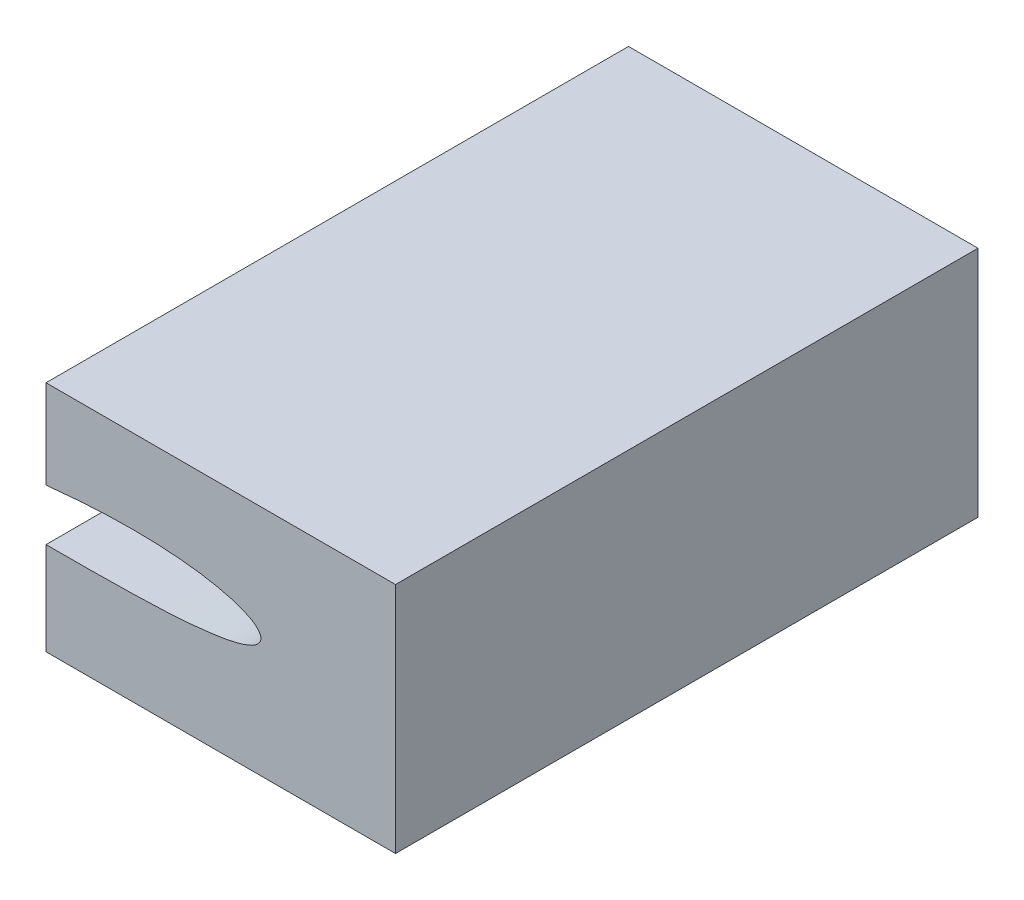
ISO-10303-21;
HEADER;
FILE_DESCRIPTION(('STEP AP214'),'2;1');
FILE_NAME('part.step','',(''),(''),'','','');
FILE_SCHEMA(('AUTOMOTIVE_DESIGN { 1 0 10303 214 1 1 1 1 }'));
ENDSEC;
DATA;
#1=APPLICATION_CONTEXT('core data for automotive mechanical design processes');
#2=APPLICATION_PROTOCOL_DEFINITION('international standard','automotive_design',2000,#1);
#3=PRODUCT_CONTEXT('',#1,'mechanical');
#4=PRODUCT('Part','Part','',(#3));
#5=PRODUCT_RELATED_PRODUCT_CATEGORY('part','',(#4));
#6=PRODUCT_DEFINITION_FORMATION('','',#4);
#7=PRODUCT_DEFINITION_CONTEXT('part definition',#1,'design');
#8=PRODUCT_DEFINITION('design','',#6,#7);
#9=PRODUCT_DEFINITION_SHAPE('','',#8);
#10=(LENGTH_UNIT() NAMED_UNIT(*) SI_UNIT(.MILLI.,.METRE.));
#11=(NAMED_UNIT(*) PLANE_ANGLE_UNIT() SI_UNIT($,.RADIAN.));
#12=(NAMED_UNIT(*) SI_UNIT($,.STERADIAN.) SOLID_ANGLE_UNIT());
#13=UNCERTAINTY_MEASURE_WITH_UNIT(LENGTH_MEASURE(1.E-05),#10,'distance_accuracy_value','');
#14=(GEOMETRIC_REPRESENTATION_CONTEXT(3) GLOBAL_UNCERTAINTY_ASSIGNED_CONTEXT((#13)) GLOBAL_UNIT_ASSIGNED_CONTEXT((#10,
#11,#12)) REPRESENTATION_CONTEXT('',''));
#15=CARTESIAN_POINT('',(0.,0.,0.));
#16=DIRECTION('',(0.,0.,1.));
#17=DIRECTION('',(1.,0.,0.));
#18=AXIS2_PLACEMENT_3D('',#15,#16,#17);
#19=CARTESIAN_POINT('',(-1.23685783837146E-10,5.3903572489181,50.));
#20=DIRECTION('',(-1.,0.,0.));
#21=DIRECTION('',(0.,0.,1.));
#22=AXIS2_PLACEMENT_3D('',#19,#20,#21);
#23=PLANE('',#22);
#24=DIRECTION('',(0.,1.,0.));
#25=VECTOR('',#24,1.);
#26=CARTESIAN_POINT('',(-1.23685783837146E-10,5.3903572489181,0.));
#27=LINE('',#26,#25);
#28=CARTESIAN_POINT('',(-1.23685783837146E-10,5.3903572489181,0.));
#29=VERTEX_POINT('',#28);
#30=CARTESIAN_POINT('',(-1.23685783837146E-10,12.9999999999869,0.));
#31=VERTEX_POINT('',#30);
#32=EDGE_CURVE('E141',#29,#31,#27,.T.);
#33=ORIENTED_EDGE('',*,*,#32,.F.);
#34=DIRECTION('',(0.,0.,-1.));
#35=VECTOR('',#34,1.);
#36=CARTESIAN_POINT('',(-1.23685783837146E-10,5.3903572489181,50.));
#37=LINE('',#36,#35);
#38=CARTESIAN_POINT('',(-1.23685783837146E-10,5.3903572489181,50.));
#39=VERTEX_POINT('',#38);
#40=EDGE_CURVE('E11',#39,#29,#37,.T.);
#41=ORIENTED_EDGE('',*,*,#40,.F.);
#42=DIRECTION('',(0.,1.,0.));
#43=VECTOR('',#42,1.);
#44=CARTESIAN_POINT('',(-1.23685783837146E-10,5.3903572489181,50.));
#45=LINE('',#44,#43);
#46=CARTESIAN_POINT('',(-1.23685783837146E-10,12.9999999999869,50.));
#47=VERTEX_POINT('',#46);
#48=EDGE_CURVE('E187',#39,#47,#45,.T.);
#49=ORIENTED_EDGE('',*,*,#48,.T.);
#50=DIRECTION('',(0.,0.,-1.));
#51=VECTOR('',#50,1.);
#52=CARTESIAN_POINT('',(-1.23685783837146E-10,12.9999999999869,50.));
#53=LINE('',#52,#51);
#54=EDGE_CURVE('E48',#47,#31,#53,.T.);
#55=ORIENTED_EDGE('',*,*,#54,.T.);
#56=EDGE_LOOP('',(#33,#41,#49,#55));
#57=FACE_BOUND('',#56,.T.);
#58=ADVANCED_FACE('F45',(#57),#23,.T.);
#59=CARTESIAN_POINT('',(-1.23685783837146E-10,5.3903572489181,50.));
#60=CARTESIAN_POINT('',(0.775234041666777,5.4708421628588,50.));
#61=CARTESIAN_POINT('',(2.87904062608273,5.66694971675814,50.));
#62=CARTESIAN_POINT('',(5.65663300613801,5.82166567046183,50.));
#63=CARTESIAN_POINT('',(8.32675259690961,5.82769469805753,50.));
#64=CARTESIAN_POINT('',(10.3344227466668,5.75336243849033,50.));
#65=CARTESIAN_POINT('',(12.3487381110996,5.58478917666611,50.));
#66=CARTESIAN_POINT('',(14.0296115507672,5.34229294910058,50.));
#67=CARTESIAN_POINT('',(15.3742363962098,5.04362312640873,50.));
#68=CARTESIAN_POINT('',(16.3960036671066,4.76332551661876,50.));
#69=CARTESIAN_POINT('',(17.2661951406884,4.42275119067307,50.));
#70=CARTESIAN_POINT('',(18.0225851244137,3.99680442296854,50.));
#71=CARTESIAN_POINT('',(18.6993302017787,3.23262566595143,50.));
#72=CARTESIAN_POINT('',(18.0627040343827,2.50715906550894,50.));
#73=CARTESIAN_POINT('',(17.3539555916326,2.15801290721747,50.));
#74=CARTESIAN_POINT('',(16.5145502124557,1.87965586188548,50.));
#75=CARTESIAN_POINT('',(15.5178113775276,1.66283214821147,50.));
#76=CARTESIAN_POINT('',(14.1898861770397,1.45695703559779,50.));
#77=CARTESIAN_POINT('',(12.5292288404234,1.27061703690951,50.));
#78=CARTESIAN_POINT('',(10.5312398255062,1.13774349521847,50.));
#79=CARTESIAN_POINT('',(8.53241216916766,1.0568328067109,50.));
#80=CARTESIAN_POINT('',(5.86546893522196,0.99931555219411,50.));
#81=CARTESIAN_POINT('',(3.02121333987203,0.965549806440602,50.));
#82=CARTESIAN_POINT('',(0.843575185785393,0.965089891251065,50.));
#83=CARTESIAN_POINT('',(2.8796409701215E-13,0.968636760709384,50.));
#84=B_SPLINE_CURVE_WITH_KNOTS('',3,(#59,#60,#61,#62,#63,#64,#65,#66,#67,#68,#69,#70,#71,#72,#73,
#74,#75,#76,#77,#78,#79,#80,#81,#82,#83),.UNSPECIFIED.,.F.,.F.,(4,1,1,1,1,1,1,1,1,1,1,1,1,1,1,1,
1,1,1,1,1,1,4),(0.268254550038408,0.296916574601493,0.345952721793533,0.37049162556991,
0.395091203654929,0.41981479582396,0.444798575016595,0.457489818915221,0.470406405435489,
0.483879408669829,0.491264120322896,0.503458853294664,0.513609129403887,0.520450990700287,
0.533235387615153,0.545691039147803,0.558031884237173,0.582609167247894,0.607134741746914,
0.631652079836766,0.656174271859652,0.705233949250519,0.73625719822174),.UNSPECIFIED.);
#85=DIRECTION('',(0.,0.,-1.));
#86=VECTOR('',#85,1.);
#87=SURFACE_OF_LINEAR_EXTRUSION('',#84,#86);
#88=CARTESIAN_POINT('',(-1.23685783837146E-10,5.3903572489181,0.));
#89=CARTESIAN_POINT('',(0.775234041666777,5.4708421628588,0.));
#90=CARTESIAN_POINT('',(2.87904062608273,5.66694971675814,0.));
#91=CARTESIAN_POINT('',(5.65663300613801,5.82166567046183,0.));
#92=CARTESIAN_POINT('',(8.32675259690961,5.82769469805753,0.));
#93=CARTESIAN_POINT('',(10.3344227466668,5.75336243849033,0.));
#94=CARTESIAN_POINT('',(12.3487381110996,5.58478917666611,0.));
#95=CARTESIAN_POINT('',(14.0296115507672,5.34229294910058,0.));
#96=CARTESIAN_POINT('',(15.3742363962098,5.04362312640873,0.));
#97=CARTESIAN_POINT('',(16.3960036671066,4.76332551661876,0.));
#98=CARTESIAN_POINT('',(17.2661951406884,4.42275119067307,0.));
#99=CARTESIAN_POINT('',(18.0225851244137,3.99680442296854,0.));
#100=CARTESIAN_POINT('',(18.6993302017787,3.23262566595143,0.));
#101=CARTESIAN_POINT('',(18.0627040343827,2.50715906550894,0.));
#102=CARTESIAN_POINT('',(17.3539555916326,2.15801290721747,0.));
#103=CARTESIAN_POINT('',(16.5145502124557,1.87965586188548,0.));
#104=CARTESIAN_POINT('',(15.5178113775276,1.66283214821147,0.));
#105=CARTESIAN_POINT('',(14.1898861770397,1.45695703559779,0.));
#106=CARTESIAN_POINT('',(12.5292288404234,1.27061703690951,0.));
#107=CARTESIAN_POINT('',(10.5312398255062,1.13774349521847,0.));
#108=CARTESIAN_POINT('',(8.53241216916766,1.0568328067109,0.));
#109=CARTESIAN_POINT('',(5.86546893522196,0.99931555219411,0.));
#110=CARTESIAN_POINT('',(3.02121333987203,0.965549806440602,0.));
#111=CARTESIAN_POINT('',(0.843575185785393,0.965089891251065,0.));
#112=CARTESIAN_POINT('',(2.8796409701215E-13,0.968636760709384,0.));
#113=B_SPLINE_CURVE_WITH_KNOTS('',3,(#88,#89,#90,#91,#92,#93,#94,#95,#96,#97,#98,#99,#100,#101,
#102,#103,#104,#105,#106,#107,#108,#109,#110,#111,#112),.UNSPECIFIED.,.F.,.F.,(4,1,1,1,1,1,1,1,
1,1,1,1,1,1,1,1,1,1,1,1,1,1,4),(0.268254550038408,0.296916574601493,0.345952721793533,
0.37049162556991,0.395091203654929,0.41981479582396,0.444798575016595,0.457489818915221,
0.470406405435489,0.483879408669829,0.491264120322896,0.503458853294664,0.513609129403887,
0.520450990700287,0.533235387615153,0.545691039147803,0.558031884237173,0.582609167247894,
0.607134741746914,0.631652079836766,0.656174271859652,0.705233949250519,0.73625719822174),.UNSPECIFIED.);
#114=CARTESIAN_POINT('',(0.,0.968636760709384,0.));
#115=VERTEX_POINT('',#114);
#116=EDGE_CURVE('E85',#29,#115,#113,.T.);
#117=ORIENTED_EDGE('',*,*,#116,.T.);
#118=DIRECTION('',(0.,0.,-1.));
#119=VECTOR('',#118,1.);
#120=CARTESIAN_POINT('',(0.,0.968636760709384,50.));
#121=LINE('',#120,#119);
#122=CARTESIAN_POINT('',(0.,0.968636760709384,50.));
#123=VERTEX_POINT('',#122);
#124=EDGE_CURVE('E55',#123,#115,#121,.T.);
#125=ORIENTED_EDGE('',*,*,#124,.F.);
#126=EDGE_CURVE('E111',#39,#123,#84,.T.);
#127=ORIENTED_EDGE('',*,*,#126,.F.);
#128=ORIENTED_EDGE('',*,*,#40,.T.);
#129=EDGE_LOOP('',(#117,#125,#127,#128));
#130=FACE_BOUND('',#129,.T.);
#131=ADVANCED_FACE('F147',(#130),#87,.F.);
#132=CARTESIAN_POINT('',(0.,0.968636760709384,50.));
#133=DIRECTION('',(1.,0.,0.));
#134=DIRECTION('',(0.,1.,0.));
#135=AXIS2_PLACEMENT_3D('',#132,#133,#134);
#136=PLANE('',#135);
#137=DIRECTION('',(0.,-1.,0.));
#138=VECTOR('',#137,1.);
#139=CARTESIAN_POINT('',(0.,0.968636760709384,0.));
#140=LINE('',#139,#138);
#141=CARTESIAN_POINT('',(2.8796409701215E-13,-7.,0.));
#142=VERTEX_POINT('',#141);
#143=EDGE_CURVE('E119',#115,#142,#140,.T.);
#144=ORIENTED_EDGE('',*,*,#143,.T.);
#145=DIRECTION('',(0.,0.,-1.));
#146=VECTOR('',#145,1.);
#147=CARTESIAN_POINT('',(2.8796409701215E-13,-7.,50.));
#148=LINE('',#147,#146);
#149=CARTESIAN_POINT('',(2.8796409701215E-13,-7.,50.));
#150=VERTEX_POINT('',#149);
#151=EDGE_CURVE('E116',#150,#142,#148,.T.);
#152=ORIENTED_EDGE('',*,*,#151,.F.);
#153=DIRECTION('',(0.,-1.,0.));
#154=VECTOR('',#153,1.);
#155=CARTESIAN_POINT('',(0.,0.968636760709384,50.));
#156=LINE('',#155,#154);
#157=EDGE_CURVE('E103',#123,#150,#156,.T.);
#158=ORIENTED_EDGE('',*,*,#157,.F.);
#159=ORIENTED_EDGE('',*,*,#124,.T.);
#160=EDGE_LOOP('',(#144,#152,#158,#159));
#161=FACE_BOUND('',#160,.T.);
#162=ADVANCED_FACE('F117',(#161),#136,.F.);
#163=CARTESIAN_POINT('',(2.8796409701215E-13,-7.,50.));
#164=DIRECTION('',(0.,1.,0.));
#165=DIRECTION('',(0.,0.,1.));
#166=AXIS2_PLACEMENT_3D('',#163,#164,#165);
#167=PLANE('',#166);
#168=DIRECTION('',(1.,0.,0.));
#169=VECTOR('',#168,1.);
#170=CARTESIAN_POINT('',(2.8796409701215E-13,-7.,0.));
#171=LINE('',#170,#169);
#172=CARTESIAN_POINT('',(30.0000000000003,-7.,0.));
#173=VERTEX_POINT('',#172);
#174=EDGE_CURVE('E177',#142,#173,#171,.T.);
#175=ORIENTED_EDGE('',*,*,#174,.T.);
#176=DIRECTION('',(0.,0.,-1.));
#177=VECTOR('',#176,1.);
#178=CARTESIAN_POINT('',(30.0000000000003,-7.,50.));
#179=LINE('',#178,#177);
#180=CARTESIAN_POINT('',(30.0000000000003,-7.,50.));
#181=VERTEX_POINT('',#180);
#182=EDGE_CURVE('E124',#181,#173,#179,.T.);
#183=ORIENTED_EDGE('',*,*,#182,.F.);
#184=DIRECTION('',(1.,0.,0.));
#185=VECTOR('',#184,1.);
#186=CARTESIAN_POINT('',(2.8796409701215E-13,-7.,50.));
#187=LINE('',#186,#185);
#188=EDGE_CURVE('E109',#150,#181,#187,.T.);
#189=ORIENTED_EDGE('',*,*,#188,.F.);
#190=ORIENTED_EDGE('',*,*,#151,.T.);
#191=EDGE_LOOP('',(#175,#183,#189,#190));
#192=FACE_BOUND('',#191,.T.);
#193=ADVANCED_FACE('F126',(#192),#167,.F.);
#194=CARTESIAN_POINT('',(30.0000000000003,12.9999999999869,50.));
#195=DIRECTION('',(1.,0.,0.));
#196=DIRECTION('',(0.,1.,0.));
#197=AXIS2_PLACEMENT_3D('',#194,#195,#196);
#198=PLANE('',#197);
#199=DIRECTION('',(0.,-1.,0.));
#200=VECTOR('',#199,1.);
#201=CARTESIAN_POINT('',(30.0000000000003,12.9999999999869,0.));
#202=LINE('',#201,#200);
#203=CARTESIAN_POINT('',(30.0000000000003,12.9999999999869,0.));
#204=VERTEX_POINT('',#203);
#205=EDGE_CURVE('E174',#204,#173,#202,.T.);
#206=ORIENTED_EDGE('',*,*,#205,.F.);
#207=DIRECTION('',(0.,0.,-1.));
#208=VECTOR('',#207,1.);
#209=CARTESIAN_POINT('',(30.0000000000003,12.9999999999869,50.));
#210=LINE('',#209,#208);
#211=CARTESIAN_POINT('',(30.0000000000003,12.9999999999869,50.));
#212=VERTEX_POINT('',#211);
#213=EDGE_CURVE('E195',#212,#204,#210,.T.);
#214=ORIENTED_EDGE('',*,*,#213,.F.);
#215=DIRECTION('',(0.,-1.,0.));
#216=VECTOR('',#215,1.);
#217=CARTESIAN_POINT('',(30.0000000000003,12.9999999999869,50.));
#218=LINE('',#217,#216);
#219=EDGE_CURVE('E129',#212,#181,#218,.T.);
#220=ORIENTED_EDGE('',*,*,#219,.T.);
#221=ORIENTED_EDGE('',*,*,#182,.T.);
#222=EDGE_LOOP('',(#206,#214,#220,#221));
#223=FACE_BOUND('',#222,.T.);
#224=ADVANCED_FACE('F157',(#223),#198,.T.);
#225=CARTESIAN_POINT('',(-1.23685783837146E-10,12.9999999999869,50.));
#226=DIRECTION('',(0.,1.,0.));
#227=DIRECTION('',(0.,0.,1.));
#228=AXIS2_PLACEMENT_3D('',#225,#226,#227);
#229=PLANE('',#228);
#230=DIRECTION('',(1.,0.,0.));
#231=VECTOR('',#230,1.);
#232=CARTESIAN_POINT('',(-1.23685783837146E-10,12.9999999999869,0.));
#233=LINE('',#232,#231);
#234=EDGE_CURVE('E172',#31,#204,#233,.T.);
#235=ORIENTED_EDGE('',*,*,#234,.F.);
#236=ORIENTED_EDGE('',*,*,#54,.F.);
#237=DIRECTION('',(1.,0.,0.));
#238=VECTOR('',#237,1.);
#239=CARTESIAN_POINT('',(-1.23685783837146E-10,12.9999999999869,50.));
#240=LINE('',#239,#238);
#241=EDGE_CURVE('E132',#47,#212,#240,.T.);
#242=ORIENTED_EDGE('',*,*,#241,.T.);
#243=ORIENTED_EDGE('',*,*,#213,.T.);
#244=EDGE_LOOP('',(#235,#236,#242,#243));
#245=FACE_BOUND('',#244,.T.);
#246=ADVANCED_FACE('F159',(#245),#229,.T.);
#247=CARTESIAN_POINT('',(18.4464752213002,3.27688009727676,50.));
#248=DIRECTION('',(0.,0.,1.));
#249=DIRECTION('',(1.,0.,0.));
#250=AXIS2_PLACEMENT_3D('',#247,#248,#249);
#251=PLANE('',#250);
#252=ORIENTED_EDGE('',*,*,#48,.F.);
#253=ORIENTED_EDGE('',*,*,#126,.T.);
#254=ORIENTED_EDGE('',*,*,#157,.T.);
#255=ORIENTED_EDGE('',*,*,#188,.T.);
#256=ORIENTED_EDGE('',*,*,#219,.F.);
#257=ORIENTED_EDGE('',*,*,#241,.F.);
#258=EDGE_LOOP('',(#252,#253,#254,#255,#256,#257));
#259=FACE_BOUND('',#258,.T.);
#260=ADVANCED_FACE('F106',(#259),#251,.T.);
#261=CARTESIAN_POINT('',(18.4464752213002,3.27688009727676,0.));
#262=DIRECTION('',(0.,0.,1.));
#263=DIRECTION('',(1.,0.,0.));
#264=AXIS2_PLACEMENT_3D('',#261,#262,#263);
#265=PLANE('',#264);
#266=ORIENTED_EDGE('',*,*,#32,.T.);
#267=ORIENTED_EDGE('',*,*,#234,.T.);
#268=ORIENTED_EDGE('',*,*,#205,.T.);
#269=ORIENTED_EDGE('',*,*,#174,.F.);
#270=ORIENTED_EDGE('',*,*,#143,.F.);
#271=ORIENTED_EDGE('',*,*,#116,.F.);
#272=EDGE_LOOP('',(#266,#267,#268,#269,#270,#271));
#273=FACE_BOUND('',#272,.T.);
#274=ADVANCED_FACE('F151',(#273),#265,.F.);
#275=CLOSED_SHELL('',(#58,#131,#162,#193,#224,#246,#260,#274));
#276=MANIFOLD_SOLID_BREP('B2',#275);
#277=ADVANCED_BREP_SHAPE_REPRESENTATION('',(#18,#276),#14);
#278=SHAPE_DEFINITION_REPRESENTATION(#9,#277);
ENDSEC;
END-ISO-10303-21;
